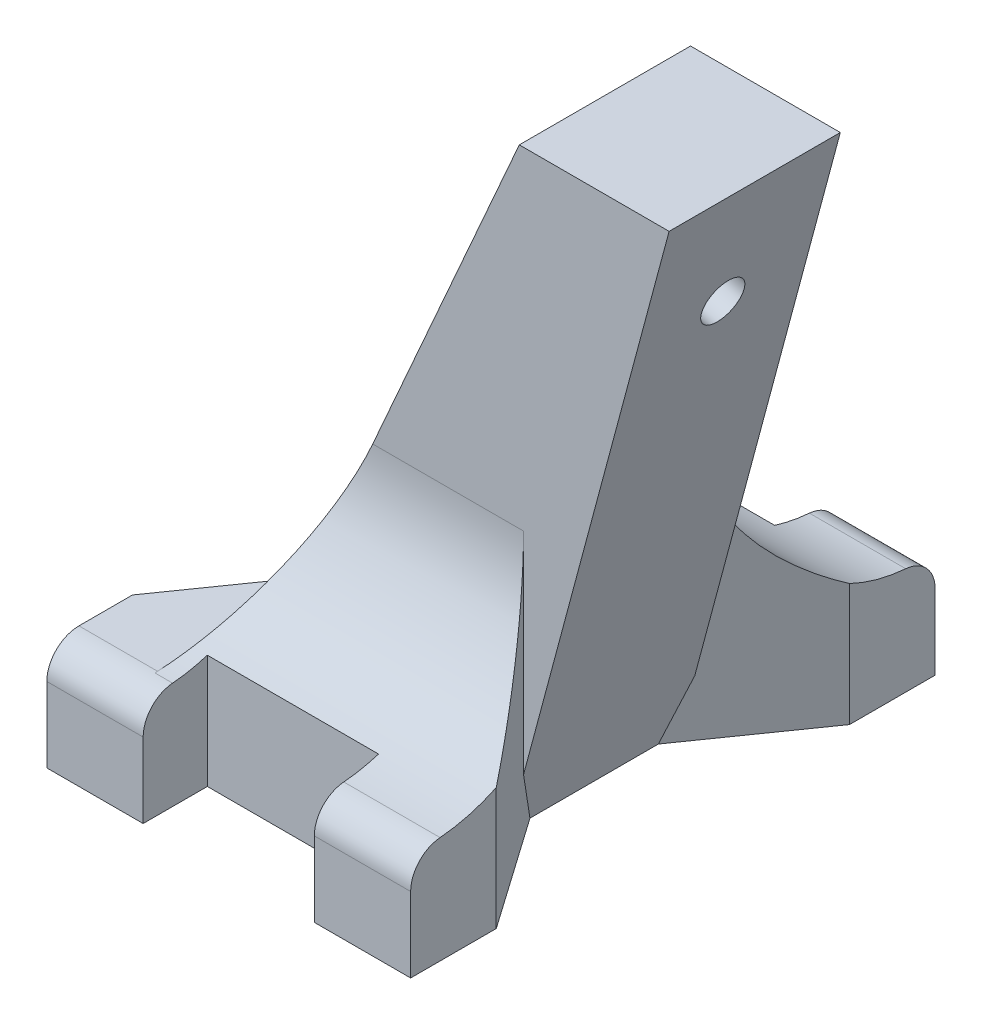
ISO-10303-21;
HEADER;
FILE_DESCRIPTION(('STEP AP214'),'2;1');
FILE_NAME('part.step','',(''),(''),'','','');
FILE_SCHEMA(('AUTOMOTIVE_DESIGN { 1 0 10303 214 1 1 1 1 }'));
ENDSEC;
DATA;
#1=APPLICATION_CONTEXT('core data for automotive mechanical design processes');
#2=APPLICATION_PROTOCOL_DEFINITION('international standard','automotive_design',2000,#1);
#3=PRODUCT_CONTEXT('',#1,'mechanical');
#4=PRODUCT('Part','Part','',(#3));
#5=PRODUCT_RELATED_PRODUCT_CATEGORY('part','',(#4));
#6=PRODUCT_DEFINITION_FORMATION('','',#4);
#7=PRODUCT_DEFINITION_CONTEXT('part definition',#1,'design');
#8=PRODUCT_DEFINITION('design','',#6,#7);
#9=PRODUCT_DEFINITION_SHAPE('','',#8);
#10=(LENGTH_UNIT() NAMED_UNIT(*) SI_UNIT(.MILLI.,.METRE.));
#11=(NAMED_UNIT(*) PLANE_ANGLE_UNIT() SI_UNIT($,.RADIAN.));
#12=(NAMED_UNIT(*) SI_UNIT($,.STERADIAN.) SOLID_ANGLE_UNIT());
#13=UNCERTAINTY_MEASURE_WITH_UNIT(LENGTH_MEASURE(1.E-05),#10,'distance_accuracy_value','');
#14=(GEOMETRIC_REPRESENTATION_CONTEXT(3) GLOBAL_UNCERTAINTY_ASSIGNED_CONTEXT((#13)) GLOBAL_UNIT_ASSIGNED_CONTEXT((#10,
#11,#12)) REPRESENTATION_CONTEXT('',''));
#15=CARTESIAN_POINT('',(0.,0.,0.));
#16=DIRECTION('',(0.,0.,1.));
#17=DIRECTION('',(1.,0.,0.));
#18=AXIS2_PLACEMENT_3D('',#15,#16,#17);
#19=CARTESIAN_POINT('',(-11.7631107649885,5.18773446003204,8.));
#20=DIRECTION('',(0.914971602220709,-0.403518236427635,0.));
#21=DIRECTION('',(0.403518236427635,0.914971602220709,0.));
#22=AXIS2_PLACEMENT_3D('',#19,#20,#21);
#23=PLANE('',#22);
#24=CARTESIAN_POINT('',(7.41347080086838,48.6703480731465,0.));
#25=DIRECTION('',(0.914971602220709,-0.403518236427635,0.));
#26=DIRECTION('',(0.403518236427635,0.914971602220709,0.));
#27=AXIS2_PLACEMENT_3D('',#24,#25,#26);
#28=ELLIPSE('',#27,2.02381441539603,2.);
#29=CARTESIAN_POINT('',(6.59682477711095,46.8186153548942,0.));
#30=VERTEX_POINT('',#29);
#31=CARTESIAN_POINT('',(8.23011682462581,50.5220807913988,0.));
#32=VERTEX_POINT('',#31);
#33=EDGE_CURVE('E249',#30,#32,#28,.T.);
#34=ORIENTED_EDGE('',*,*,#33,.T.);
#35=CARTESIAN_POINT('',(7.41347080086838,48.6703480731465,0.));
#36=DIRECTION('',(-0.914971602220709,0.403518236427635,0.));
#37=DIRECTION('',(-0.403518236427635,-0.914971602220709,0.));
#38=AXIS2_PLACEMENT_3D('',#35,#36,#37);
#39=CIRCLE('',#38,2.02381441539603);
#40=EDGE_CURVE('E54',#32,#30,#39,.T.);
#41=ORIENTED_EDGE('',*,*,#40,.T.);
#42=EDGE_LOOP('',(#34,#41));
#43=FACE_BOUND('',#42,.T.);
#44=ADVANCED_FACE('F40',(#43),#23,.F.);
#45=EDGE_CURVE('E253',#32,#30,#28,.T.);
#46=ORIENTED_EDGE('',*,*,#45,.T.);
#47=EDGE_CURVE('E240',#30,#32,#39,.T.);
#48=ORIENTED_EDGE('',*,*,#47,.T.);
#49=EDGE_LOOP('',(#46,#48));
#50=FACE_BOUND('',#49,.T.);
#51=ADVANCED_FACE('F255',(#50),#23,.F.);
#52=CARTESIAN_POINT('',(0.,10.,0.));
#53=DIRECTION('',(0.,1.,0.));
#54=DIRECTION('',(0.,0.,1.));
#55=AXIS2_PLACEMENT_3D('',#52,#53,#54);
#56=PLANE('',#55);
#57=DIRECTION('',(-1.,0.,0.));
#58=VECTOR('',#57,1.);
#59=CARTESIAN_POINT('',(0.,10.,21.51));
#60=LINE('',#59,#58);
#61=CARTESIAN_POINT('',(-17.,10.,21.51));
#62=VERTEX_POINT('',#61);
#63=CARTESIAN_POINT('',(-9.64081877341594,10.,21.51));
#64=VERTEX_POINT('',#63);
#65=EDGE_CURVE('E342',#62,#64,#60,.F.);
#66=ORIENTED_EDGE('',*,*,#65,.T.);
#67=DIRECTION('',(0.,0.,-1.));
#68=VECTOR('',#67,1.);
#69=CARTESIAN_POINT('',(-9.64081877341594,10.,8.));
#70=LINE('',#69,#68);
#71=CARTESIAN_POINT('',(-9.64081877341594,10.,6.));
#72=VERTEX_POINT('',#71);
#73=EDGE_CURVE('E467',#64,#72,#70,.T.);
#74=ORIENTED_EDGE('',*,*,#73,.T.);
#75=DIRECTION('',(0.573576436351047,0.,-0.819152044288991));
#76=VECTOR('',#75,1.);
#77=CARTESIAN_POINT('',(-3.65000863368049,10.,-2.55576355983361));
#78=LINE('',#77,#76);
#79=CARTESIAN_POINT('',(-17.,10.,16.51));
#80=VERTEX_POINT('',#79);
#81=EDGE_CURVE('E444',#80,#72,#78,.T.);
#82=ORIENTED_EDGE('',*,*,#81,.F.);
#83=DIRECTION('',(0.,0.,-1.));
#84=VECTOR('',#83,1.);
#85=CARTESIAN_POINT('',(-17.,10.,0.));
#86=LINE('',#85,#84);
#87=EDGE_CURVE('E384',#62,#80,#86,.T.);
#88=ORIENTED_EDGE('',*,*,#87,.F.);
#89=EDGE_LOOP('',(#66,#74,#82,#88));
#90=FACE_BOUND('',#89,.T.);
#91=ADVANCED_FACE('F512',(#90),#56,.T.);
#92=CARTESIAN_POINT('',(-9.64081877341594,10.,-6.00000000000002));
#93=VERTEX_POINT('',#92);
#94=CARTESIAN_POINT('',(-9.64081877341594,10.,-21.51));
#95=VERTEX_POINT('',#94);
#96=EDGE_CURVE('E470',#93,#95,#70,.T.);
#97=ORIENTED_EDGE('',*,*,#96,.T.);
#98=DIRECTION('',(-1.,0.,0.));
#99=VECTOR('',#98,1.);
#100=CARTESIAN_POINT('',(-17.,10.,-21.51));
#101=LINE('',#100,#99);
#102=CARTESIAN_POINT('',(-17.,10.,-21.51));
#103=VERTEX_POINT('',#102);
#104=EDGE_CURVE('E340',#95,#103,#101,.T.);
#105=ORIENTED_EDGE('',*,*,#104,.T.);
#106=DIRECTION('',(0.,0.,1.));
#107=VECTOR('',#106,1.);
#108=CARTESIAN_POINT('',(-17.,10.,0.));
#109=LINE('',#108,#107);
#110=CARTESIAN_POINT('',(-17.,10.,-16.51));
#111=VERTEX_POINT('',#110);
#112=EDGE_CURVE('E388',#103,#111,#109,.T.);
#113=ORIENTED_EDGE('',*,*,#112,.T.);
#114=DIRECTION('',(0.573576436351047,0.,0.819152044288991));
#115=VECTOR('',#114,1.);
#116=CARTESIAN_POINT('',(-3.65000863368049,10.,2.55576355983361));
#117=LINE('',#116,#115);
#118=EDGE_CURVE('E449',#111,#93,#117,.T.);
#119=ORIENTED_EDGE('',*,*,#118,.T.);
#120=EDGE_LOOP('',(#97,#105,#113,#119));
#121=FACE_BOUND('',#120,.T.);
#122=ADVANCED_FACE('F561',(#121),#56,.T.);
#123=CARTESIAN_POINT('',(8.,10.,0.));
#124=DIRECTION('',(-1.,0.,0.));
#125=DIRECTION('',(0.,0.,1.));
#126=AXIS2_PLACEMENT_3D('',#123,#124,#125);
#127=PLANE('',#126);
#128=DIRECTION('',(0.,-1.,0.));
#129=VECTOR('',#128,1.);
#130=CARTESIAN_POINT('',(8.,10.,-18.51));
#131=LINE('',#130,#129);
#132=CARTESIAN_POINT('',(8.,10.6259955130901,-18.51));
#133=VERTEX_POINT('',#132);
#134=CARTESIAN_POINT('',(8.,0.,-18.51));
#135=VERTEX_POINT('',#134);
#136=EDGE_CURVE('E345',#133,#135,#131,.T.);
#137=ORIENTED_EDGE('',*,*,#136,.F.);
#138=CARTESIAN_POINT('',(8.,24.9382245498265,-23.));
#139=DIRECTION('',(-1.,0.,0.));
#140=DIRECTION('',(0.,0.,1.));
#141=AXIS2_PLACEMENT_3D('',#138,#139,#140);
#142=CIRCLE('',#141,15.);
#143=CARTESIAN_POINT('',(8.,9.98970435267192,-21.758330190703));
#144=VERTEX_POINT('',#143);
#145=EDGE_CURVE('E282',#133,#144,#142,.F.);
#146=ORIENTED_EDGE('',*,*,#145,.T.);
#147=CARTESIAN_POINT('',(8.,7.,-21.51));
#148=DIRECTION('',(-1.,0.,0.));
#149=DIRECTION('',(0.,0.,1.));
#150=AXIS2_PLACEMENT_3D('',#147,#148,#149);
#151=CIRCLE('',#150,3.);
#152=CARTESIAN_POINT('',(8.,7.,-24.51));
#153=VERTEX_POINT('',#152);
#154=EDGE_CURVE('E325',#144,#153,#151,.T.);
#155=ORIENTED_EDGE('',*,*,#154,.T.);
#156=DIRECTION('',(0.,-1.,0.));
#157=VECTOR('',#156,1.);
#158=CARTESIAN_POINT('',(8.,10.,-24.51));
#159=LINE('',#158,#157);
#160=CARTESIAN_POINT('',(8.,0.,-24.51));
#161=VERTEX_POINT('',#160);
#162=EDGE_CURVE('E382',#153,#161,#159,.T.);
#163=ORIENTED_EDGE('',*,*,#162,.T.);
#164=DIRECTION('',(0.,0.,-1.));
#165=VECTOR('',#164,1.);
#166=CARTESIAN_POINT('',(8.,0.,0.));
#167=LINE('',#166,#165);
#168=EDGE_CURVE('E439',#135,#161,#167,.T.);
#169=ORIENTED_EDGE('',*,*,#168,.F.);
#170=EDGE_LOOP('',(#137,#146,#155,#163,#169));
#171=FACE_BOUND('',#170,.T.);
#172=ADVANCED_FACE('F621',(#171),#127,.T.);
#173=CARTESIAN_POINT('',(0.,10.,-18.51));
#174=DIRECTION('',(0.,0.,1.));
#175=DIRECTION('',(1.,0.,0.));
#176=AXIS2_PLACEMENT_3D('',#173,#174,#175);
#177=PLANE('',#176);
#178=DIRECTION('',(-1.,0.,0.));
#179=VECTOR('',#178,1.);
#180=CARTESIAN_POINT('',(0.,0.,-18.51));
#181=LINE('',#180,#179);
#182=CARTESIAN_POINT('',(-8.,0.,-18.51));
#183=VERTEX_POINT('',#182);
#184=EDGE_CURVE('E437',#135,#183,#181,.T.);
#185=ORIENTED_EDGE('',*,*,#184,.T.);
#186=DIRECTION('',(0.,-1.,0.));
#187=VECTOR('',#186,1.);
#188=CARTESIAN_POINT('',(-8.,10.,-18.51));
#189=LINE('',#188,#187);
#190=CARTESIAN_POINT('',(-8.,10.6259955130902,-18.51));
#191=VERTEX_POINT('',#190);
#192=EDGE_CURVE('E347',#191,#183,#189,.T.);
#193=ORIENTED_EDGE('',*,*,#192,.F.);
#194=DIRECTION('',(1.,0.,0.));
#195=VECTOR('',#194,1.);
#196=CARTESIAN_POINT('',(-8.,10.6259955130902,-18.51));
#197=LINE('',#196,#195);
#198=EDGE_CURVE('E284',#191,#133,#197,.T.);
#199=ORIENTED_EDGE('',*,*,#198,.T.);
#200=ORIENTED_EDGE('',*,*,#136,.T.);
#201=EDGE_LOOP('',(#185,#193,#199,#200));
#202=FACE_BOUND('',#201,.T.);
#203=ADVANCED_FACE('F626',(#202),#177,.F.);
#204=CARTESIAN_POINT('',(-8.,10.,0.));
#205=DIRECTION('',(-1.,0.,0.));
#206=DIRECTION('',(0.,0.,1.));
#207=AXIS2_PLACEMENT_3D('',#204,#205,#206);
#208=PLANE('',#207);
#209=DIRECTION('',(0.,-1.,0.));
#210=VECTOR('',#209,1.);
#211=CARTESIAN_POINT('',(-8.,10.,-24.51));
#212=LINE('',#211,#210);
#213=CARTESIAN_POINT('',(-8.,7.,-24.51));
#214=VERTEX_POINT('',#213);
#215=CARTESIAN_POINT('',(-8.,0.,-24.51));
#216=VERTEX_POINT('',#215);
#217=EDGE_CURVE('E350',#214,#216,#212,.T.);
#218=ORIENTED_EDGE('',*,*,#217,.F.);
#219=CARTESIAN_POINT('',(-8.,7.,-21.51));
#220=DIRECTION('',(-1.,0.,0.));
#221=DIRECTION('',(0.,0.,1.));
#222=AXIS2_PLACEMENT_3D('',#219,#220,#221);
#223=CIRCLE('',#222,3.);
#224=CARTESIAN_POINT('',(-8.,9.98970409163776,-21.7583333333333));
#225=VERTEX_POINT('',#224);
#226=EDGE_CURVE('E333',#214,#225,#223,.F.);
#227=ORIENTED_EDGE('',*,*,#226,.T.);
#228=CARTESIAN_POINT('',(-8.,24.9382245498265,-23.));
#229=DIRECTION('',(-1.,0.,0.));
#230=DIRECTION('',(0.,0.,1.));
#231=AXIS2_PLACEMENT_3D('',#228,#229,#230);
#232=CIRCLE('',#231,15.);
#233=EDGE_CURVE('E287',#225,#191,#232,.T.);
#234=ORIENTED_EDGE('',*,*,#233,.T.);
#235=ORIENTED_EDGE('',*,*,#192,.T.);
#236=DIRECTION('',(0.,0.,-1.));
#237=VECTOR('',#236,1.);
#238=CARTESIAN_POINT('',(-8.,0.,0.));
#239=LINE('',#238,#237);
#240=EDGE_CURVE('E434',#183,#216,#239,.T.);
#241=ORIENTED_EDGE('',*,*,#240,.T.);
#242=EDGE_LOOP('',(#218,#227,#234,#235,#241));
#243=FACE_BOUND('',#242,.T.);
#244=ADVANCED_FACE('F547',(#243),#208,.F.);
#245=CARTESIAN_POINT('',(0.,10.,-24.51));
#246=DIRECTION('',(0.,0.,1.));
#247=DIRECTION('',(1.,0.,0.));
#248=AXIS2_PLACEMENT_3D('',#245,#246,#247);
#249=PLANE('',#248);
#250=DIRECTION('',(0.,-1.,0.));
#251=VECTOR('',#250,1.);
#252=CARTESIAN_POINT('',(-17.,10.,-24.51));
#253=LINE('',#252,#251);
#254=CARTESIAN_POINT('',(-17.,7.,-24.51));
#255=VERTEX_POINT('',#254);
#256=CARTESIAN_POINT('',(-17.,0.,-24.51));
#257=VERTEX_POINT('',#256);
#258=EDGE_CURVE('E352',#255,#257,#253,.T.);
#259=ORIENTED_EDGE('',*,*,#258,.F.);
#260=DIRECTION('',(-1.,0.,0.));
#261=VECTOR('',#260,1.);
#262=CARTESIAN_POINT('',(-8.,7.,-24.51));
#263=LINE('',#262,#261);
#264=EDGE_CURVE('E336',#255,#214,#263,.F.);
#265=ORIENTED_EDGE('',*,*,#264,.T.);
#266=ORIENTED_EDGE('',*,*,#217,.T.);
#267=DIRECTION('',(-1.,0.,0.));
#268=VECTOR('',#267,1.);
#269=CARTESIAN_POINT('',(0.,0.,-24.51));
#270=LINE('',#269,#268);
#271=EDGE_CURVE('E431',#216,#257,#270,.T.);
#272=ORIENTED_EDGE('',*,*,#271,.T.);
#273=EDGE_LOOP('',(#259,#265,#266,#272));
#274=FACE_BOUND('',#273,.T.);
#275=ADVANCED_FACE('F552',(#274),#249,.F.);
#276=CARTESIAN_POINT('',(-17.,10.,0.));
#277=DIRECTION('',(1.,0.,0.));
#278=DIRECTION('',(0.,0.,-1.));
#279=AXIS2_PLACEMENT_3D('',#276,#277,#278);
#280=PLANE('',#279);
#281=ORIENTED_EDGE('',*,*,#112,.F.);
#282=CARTESIAN_POINT('',(-17.,7.,-21.51));
#283=DIRECTION('',(1.,0.,0.));
#284=DIRECTION('',(0.,0.,-1.));
#285=AXIS2_PLACEMENT_3D('',#282,#283,#284);
#286=CIRCLE('',#285,3.);
#287=EDGE_CURVE('E338',#103,#255,#286,.F.);
#288=ORIENTED_EDGE('',*,*,#287,.T.);
#289=ORIENTED_EDGE('',*,*,#258,.T.);
#290=DIRECTION('',(0.,0.,1.));
#291=VECTOR('',#290,1.);
#292=CARTESIAN_POINT('',(-17.,0.,0.));
#293=LINE('',#292,#291);
#294=CARTESIAN_POINT('',(-17.,0.,-16.51));
#295=VERTEX_POINT('',#294);
#296=EDGE_CURVE('E429',#257,#295,#293,.T.);
#297=ORIENTED_EDGE('',*,*,#296,.T.);
#298=DIRECTION('',(0.,-1.,0.));
#299=VECTOR('',#298,1.);
#300=CARTESIAN_POINT('',(-17.,10.,-16.51));
#301=LINE('',#300,#299);
#302=EDGE_CURVE('E354',#111,#295,#301,.T.);
#303=ORIENTED_EDGE('',*,*,#302,.F.);
#304=EDGE_LOOP('',(#281,#288,#289,#297,#303));
#305=FACE_BOUND('',#304,.T.);
#306=ADVANCED_FACE('F558',(#305),#280,.F.);
#307=CARTESIAN_POINT('',(-3.65000863368049,10.,2.55576355983361));
#308=DIRECTION('',(0.819152044288991,0.,-0.573576436351047));
#309=DIRECTION('',(-0.573576436351047,0.,-0.819152044288991));
#310=AXIS2_PLACEMENT_3D('',#307,#308,#309);
#311=PLANE('',#310);
#312=DIRECTION('',(0.573576436351047,0.,0.819152044288991));
#313=VECTOR('',#312,1.);
#314=CARTESIAN_POINT('',(-3.65000863368049,0.,2.55576355983361));
#315=LINE('',#314,#313);
#316=CARTESIAN_POINT('',(-9.64081877341594,0.,-6.));
#317=VERTEX_POINT('',#316);
#318=EDGE_CURVE('E427',#295,#317,#315,.T.);
#319=ORIENTED_EDGE('',*,*,#318,.T.);
#320=DIRECTION('',(0.,-1.,0.));
#321=VECTOR('',#320,1.);
#322=CARTESIAN_POINT('',(-9.64081877341594,10.,-6.));
#323=LINE('',#322,#321);
#324=EDGE_CURVE('E357',#93,#317,#323,.T.);
#325=ORIENTED_EDGE('',*,*,#324,.F.);
#326=ORIENTED_EDGE('',*,*,#118,.F.);
#327=ORIENTED_EDGE('',*,*,#302,.T.);
#328=EDGE_LOOP('',(#319,#325,#326,#327));
#329=FACE_BOUND('',#328,.T.);
#330=ADVANCED_FACE('F867',(#329),#311,.F.);
#331=CARTESIAN_POINT('',(-9.64081877341593,10.,0.));
#332=DIRECTION('',(1.,0.,0.));
#333=DIRECTION('',(0.,0.,-1.));
#334=AXIS2_PLACEMENT_3D('',#331,#332,#333);
#335=PLANE('',#334);
#336=DIRECTION('',(0.,0.,1.));
#337=VECTOR('',#336,1.);
#338=CARTESIAN_POINT('',(-9.64081877341593,0.,0.));
#339=LINE('',#338,#337);
#340=CARTESIAN_POINT('',(-9.64081877341593,0.,6.));
#341=VERTEX_POINT('',#340);
#342=EDGE_CURVE('E424',#317,#341,#339,.T.);
#343=ORIENTED_EDGE('',*,*,#342,.T.);
#344=DIRECTION('',(0.,-1.,0.));
#345=VECTOR('',#344,1.);
#346=CARTESIAN_POINT('',(-9.64081877341593,10.,6.));
#347=LINE('',#346,#345);
#348=EDGE_CURVE('E360',#72,#341,#347,.T.);
#349=ORIENTED_EDGE('',*,*,#348,.F.);
#350=DIRECTION('',(0.,0.,1.));
#351=VECTOR('',#350,1.);
#352=CARTESIAN_POINT('',(-9.64081877341593,10.,0.));
#353=LINE('',#352,#351);
#354=EDGE_CURVE('E447',#93,#72,#353,.T.);
#355=ORIENTED_EDGE('',*,*,#354,.F.);
#356=ORIENTED_EDGE('',*,*,#324,.T.);
#357=EDGE_LOOP('',(#343,#349,#355,#356));
#358=FACE_BOUND('',#357,.T.);
#359=ADVANCED_FACE('F570',(#358),#335,.F.);
#360=CARTESIAN_POINT('',(-3.65000863368049,10.,-2.55576355983361));
#361=DIRECTION('',(-0.819152044288991,0.,-0.573576436351047));
#362=DIRECTION('',(-0.573576436351047,0.,0.819152044288991));
#363=AXIS2_PLACEMENT_3D('',#360,#361,#362);
#364=PLANE('',#363);
#365=DIRECTION('',(0.573576436351047,0.,-0.819152044288991));
#366=VECTOR('',#365,1.);
#367=CARTESIAN_POINT('',(-3.65000863368049,0.,-2.55576355983361));
#368=LINE('',#367,#366);
#369=CARTESIAN_POINT('',(-17.,0.,16.51));
#370=VERTEX_POINT('',#369);
#371=EDGE_CURVE('E421',#370,#341,#368,.T.);
#372=ORIENTED_EDGE('',*,*,#371,.F.);
#373=DIRECTION('',(0.,-1.,0.));
#374=VECTOR('',#373,1.);
#375=CARTESIAN_POINT('',(-17.,10.,16.51));
#376=LINE('',#375,#374);
#377=EDGE_CURVE('E362',#80,#370,#376,.T.);
#378=ORIENTED_EDGE('',*,*,#377,.F.);
#379=ORIENTED_EDGE('',*,*,#81,.T.);
#380=ORIENTED_EDGE('',*,*,#348,.T.);
#381=EDGE_LOOP('',(#372,#378,#379,#380));
#382=FACE_BOUND('',#381,.T.);
#383=ADVANCED_FACE('F575',(#382),#364,.T.);
#384=CARTESIAN_POINT('',(-17.,10.,0.));
#385=DIRECTION('',(-1.,0.,0.));
#386=DIRECTION('',(0.,0.,1.));
#387=AXIS2_PLACEMENT_3D('',#384,#385,#386);
#388=PLANE('',#387);
#389=DIRECTION('',(0.,-1.,0.));
#390=VECTOR('',#389,1.);
#391=CARTESIAN_POINT('',(-17.,10.,24.51));
#392=LINE('',#391,#390);
#393=CARTESIAN_POINT('',(-17.,7.,24.51));
#394=VERTEX_POINT('',#393);
#395=CARTESIAN_POINT('',(-17.,0.,24.51));
#396=VERTEX_POINT('',#395);
#397=EDGE_CURVE('E364',#394,#396,#392,.T.);
#398=ORIENTED_EDGE('',*,*,#397,.F.);
#399=CARTESIAN_POINT('',(-17.,7.,21.51));
#400=DIRECTION('',(-1.,0.,0.));
#401=DIRECTION('',(0.,0.,1.));
#402=AXIS2_PLACEMENT_3D('',#399,#400,#401);
#403=CIRCLE('',#402,3.);
#404=EDGE_CURVE('E313',#394,#62,#403,.T.);
#405=ORIENTED_EDGE('',*,*,#404,.T.);
#406=ORIENTED_EDGE('',*,*,#87,.T.);
#407=ORIENTED_EDGE('',*,*,#377,.T.);
#408=DIRECTION('',(0.,0.,-1.));
#409=VECTOR('',#408,1.);
#410=CARTESIAN_POINT('',(-17.,0.,0.));
#411=LINE('',#410,#409);
#412=EDGE_CURVE('E418',#396,#370,#411,.T.);
#413=ORIENTED_EDGE('',*,*,#412,.F.);
#414=EDGE_LOOP('',(#398,#405,#406,#407,#413));
#415=FACE_BOUND('',#414,.T.);
#416=ADVANCED_FACE('F579',(#415),#388,.T.);
#417=CARTESIAN_POINT('',(0.,10.,24.51));
#418=DIRECTION('',(0.,0.,1.));
#419=DIRECTION('',(1.,0.,0.));
#420=AXIS2_PLACEMENT_3D('',#417,#418,#419);
#421=PLANE('',#420);
#422=DIRECTION('',(0.,-1.,0.));
#423=VECTOR('',#422,1.);
#424=CARTESIAN_POINT('',(-8.,10.,24.51));
#425=LINE('',#424,#423);
#426=CARTESIAN_POINT('',(-8.,7.,24.51));
#427=VERTEX_POINT('',#426);
#428=CARTESIAN_POINT('',(-8.,0.,24.51));
#429=VERTEX_POINT('',#428);
#430=EDGE_CURVE('E366',#427,#429,#425,.T.);
#431=ORIENTED_EDGE('',*,*,#430,.F.);
#432=DIRECTION('',(-1.,0.,0.));
#433=VECTOR('',#432,1.);
#434=CARTESIAN_POINT('',(0.,7.,24.51));
#435=LINE('',#434,#433);
#436=EDGE_CURVE('E315',#427,#394,#435,.T.);
#437=ORIENTED_EDGE('',*,*,#436,.T.);
#438=ORIENTED_EDGE('',*,*,#397,.T.);
#439=DIRECTION('',(-1.,0.,0.));
#440=VECTOR('',#439,1.);
#441=CARTESIAN_POINT('',(0.,0.,24.51));
#442=LINE('',#441,#440);
#443=EDGE_CURVE('E415',#429,#396,#442,.T.);
#444=ORIENTED_EDGE('',*,*,#443,.F.);
#445=EDGE_LOOP('',(#431,#437,#438,#444));
#446=FACE_BOUND('',#445,.T.);
#447=ADVANCED_FACE('F727',(#446),#421,.T.);
#448=CARTESIAN_POINT('',(-8.,10.,0.));
#449=DIRECTION('',(1.,0.,0.));
#450=DIRECTION('',(0.,0.,-1.));
#451=AXIS2_PLACEMENT_3D('',#448,#449,#450);
#452=PLANE('',#451);
#453=DIRECTION('',(0.,-1.,0.));
#454=VECTOR('',#453,1.);
#455=CARTESIAN_POINT('',(-8.,10.,18.51));
#456=LINE('',#455,#454);
#457=CARTESIAN_POINT('',(-8.,10.6259955130902,18.51));
#458=VERTEX_POINT('',#457);
#459=CARTESIAN_POINT('',(-8.,0.,18.51));
#460=VERTEX_POINT('',#459);
#461=EDGE_CURVE('E62',#458,#460,#456,.T.);
#462=ORIENTED_EDGE('',*,*,#461,.F.);
#463=CARTESIAN_POINT('',(-8.,24.9382245498265,23.));
#464=DIRECTION('',(1.,0.,0.));
#465=DIRECTION('',(0.,0.,-1.));
#466=AXIS2_PLACEMENT_3D('',#463,#464,#465);
#467=CIRCLE('',#466,15.);
#468=CARTESIAN_POINT('',(-8.,9.98970409163776,21.7583333333333));
#469=VERTEX_POINT('',#468);
#470=EDGE_CURVE('E262',#458,#469,#467,.F.);
#471=ORIENTED_EDGE('',*,*,#470,.T.);
#472=CARTESIAN_POINT('',(-8.,7.,21.51));
#473=DIRECTION('',(1.,0.,0.));
#474=DIRECTION('',(0.,0.,-1.));
#475=AXIS2_PLACEMENT_3D('',#472,#473,#474);
#476=CIRCLE('',#475,3.);
#477=EDGE_CURVE('E311',#469,#427,#476,.T.);
#478=ORIENTED_EDGE('',*,*,#477,.T.);
#479=ORIENTED_EDGE('',*,*,#430,.T.);
#480=DIRECTION('',(0.,0.,1.));
#481=VECTOR('',#480,1.);
#482=CARTESIAN_POINT('',(-8.,0.,0.));
#483=LINE('',#482,#481);
#484=EDGE_CURVE('E412',#460,#429,#483,.T.);
#485=ORIENTED_EDGE('',*,*,#484,.F.);
#486=EDGE_LOOP('',(#462,#471,#478,#479,#485));
#487=FACE_BOUND('',#486,.T.);
#488=ADVANCED_FACE('F721',(#487),#452,.T.);
#489=CARTESIAN_POINT('',(0.,10.,18.51));
#490=DIRECTION('',(0.,0.,1.));
#491=DIRECTION('',(1.,0.,0.));
#492=AXIS2_PLACEMENT_3D('',#489,#490,#491);
#493=PLANE('',#492);
#494=DIRECTION('',(-1.,0.,0.));
#495=VECTOR('',#494,1.);
#496=CARTESIAN_POINT('',(0.,0.,18.51));
#497=LINE('',#496,#495);
#498=CARTESIAN_POINT('',(8.,0.,18.51));
#499=VERTEX_POINT('',#498);
#500=EDGE_CURVE('E409',#499,#460,#497,.T.);
#501=ORIENTED_EDGE('',*,*,#500,.F.);
#502=DIRECTION('',(0.,-1.,0.));
#503=VECTOR('',#502,1.);
#504=CARTESIAN_POINT('',(8.,10.,18.51));
#505=LINE('',#504,#503);
#506=CARTESIAN_POINT('',(8.,10.6259955130901,18.51));
#507=VERTEX_POINT('',#506);
#508=EDGE_CURVE('E369',#507,#499,#505,.T.);
#509=ORIENTED_EDGE('',*,*,#508,.F.);
#510=DIRECTION('',(-1.,0.,0.));
#511=VECTOR('',#510,1.);
#512=CARTESIAN_POINT('',(8.,10.6259955130901,18.51));
#513=LINE('',#512,#511);
#514=EDGE_CURVE('E264',#507,#458,#513,.T.);
#515=ORIENTED_EDGE('',*,*,#514,.T.);
#516=ORIENTED_EDGE('',*,*,#461,.T.);
#517=EDGE_LOOP('',(#501,#509,#515,#516));
#518=FACE_BOUND('',#517,.T.);
#519=ADVANCED_FACE('F726',(#518),#493,.T.);
#520=CARTESIAN_POINT('',(8.,10.,0.));
#521=DIRECTION('',(1.,0.,0.));
#522=DIRECTION('',(0.,0.,-1.));
#523=AXIS2_PLACEMENT_3D('',#520,#521,#522);
#524=PLANE('',#523);
#525=DIRECTION('',(0.,-1.,0.));
#526=VECTOR('',#525,1.);
#527=CARTESIAN_POINT('',(8.,10.,24.51));
#528=LINE('',#527,#526);
#529=CARTESIAN_POINT('',(8.,7.,24.51));
#530=VERTEX_POINT('',#529);
#531=CARTESIAN_POINT('',(8.,0.,24.51));
#532=VERTEX_POINT('',#531);
#533=EDGE_CURVE('E371',#530,#532,#528,.T.);
#534=ORIENTED_EDGE('',*,*,#533,.F.);
#535=CARTESIAN_POINT('',(8.,7.,21.51));
#536=DIRECTION('',(1.,0.,0.));
#537=DIRECTION('',(0.,0.,-1.));
#538=AXIS2_PLACEMENT_3D('',#535,#536,#537);
#539=CIRCLE('',#538,3.);
#540=CARTESIAN_POINT('',(8.,9.98970435267192,21.758330190703));
#541=VERTEX_POINT('',#540);
#542=EDGE_CURVE('E318',#530,#541,#539,.F.);
#543=ORIENTED_EDGE('',*,*,#542,.T.);
#544=CARTESIAN_POINT('',(8.,24.9382245498265,23.));
#545=DIRECTION('',(1.,0.,0.));
#546=DIRECTION('',(0.,0.,-1.));
#547=AXIS2_PLACEMENT_3D('',#544,#545,#546);
#548=CIRCLE('',#547,15.);
#549=EDGE_CURVE('E266',#541,#507,#548,.T.);
#550=ORIENTED_EDGE('',*,*,#549,.T.);
#551=ORIENTED_EDGE('',*,*,#508,.T.);
#552=DIRECTION('',(0.,0.,1.));
#553=VECTOR('',#552,1.);
#554=CARTESIAN_POINT('',(8.,0.,0.));
#555=LINE('',#554,#553);
#556=EDGE_CURVE('E406',#499,#532,#555,.T.);
#557=ORIENTED_EDGE('',*,*,#556,.T.);
#558=EDGE_LOOP('',(#534,#543,#550,#551,#557));
#559=FACE_BOUND('',#558,.T.);
#560=ADVANCED_FACE('F738',(#559),#524,.F.);
#561=CARTESIAN_POINT('',(0.,10.,24.51));
#562=DIRECTION('',(0.,0.,-1.));
#563=DIRECTION('',(-1.,0.,0.));
#564=AXIS2_PLACEMENT_3D('',#561,#562,#563);
#565=PLANE('',#564);
#566=DIRECTION('',(0.,-1.,0.));
#567=VECTOR('',#566,1.);
#568=CARTESIAN_POINT('',(17.,10.,24.51));
#569=LINE('',#568,#567);
#570=CARTESIAN_POINT('',(17.,7.,24.51));
#571=VERTEX_POINT('',#570);
#572=CARTESIAN_POINT('',(17.,0.,24.51));
#573=VERTEX_POINT('',#572);
#574=EDGE_CURVE('E373',#571,#573,#569,.T.);
#575=ORIENTED_EDGE('',*,*,#574,.F.);
#576=DIRECTION('',(1.,0.,0.));
#577=VECTOR('',#576,1.);
#578=CARTESIAN_POINT('',(8.,7.,24.51));
#579=LINE('',#578,#577);
#580=EDGE_CURVE('E321',#571,#530,#579,.F.);
#581=ORIENTED_EDGE('',*,*,#580,.T.);
#582=ORIENTED_EDGE('',*,*,#533,.T.);
#583=DIRECTION('',(1.,0.,0.));
#584=VECTOR('',#583,1.);
#585=CARTESIAN_POINT('',(0.,0.,24.51));
#586=LINE('',#585,#584);
#587=EDGE_CURVE('E403',#532,#573,#586,.T.);
#588=ORIENTED_EDGE('',*,*,#587,.T.);
#589=EDGE_LOOP('',(#575,#581,#582,#588));
#590=FACE_BOUND('',#589,.T.);
#591=ADVANCED_FACE('F748',(#590),#565,.F.);
#592=CARTESIAN_POINT('',(17.,10.,0.));
#593=DIRECTION('',(-1.,0.,0.));
#594=DIRECTION('',(0.,0.,1.));
#595=AXIS2_PLACEMENT_3D('',#592,#593,#594);
#596=PLANE('',#595);
#597=DIRECTION('',(0.,-1.,0.));
#598=VECTOR('',#597,1.);
#599=CARTESIAN_POINT('',(17.,10.,16.51));
#600=LINE('',#599,#598);
#601=CARTESIAN_POINT('',(17.,11.4149150436443,16.51));
#602=VERTEX_POINT('',#601);
#603=CARTESIAN_POINT('',(17.,0.,16.51));
#604=VERTEX_POINT('',#603);
#605=EDGE_CURVE('E375',#602,#604,#600,.T.);
#606=ORIENTED_EDGE('',*,*,#605,.F.);
#607=CARTESIAN_POINT('',(17.,24.9382245498265,23.));
#608=DIRECTION('',(-1.,0.,0.));
#609=DIRECTION('',(0.,0.,1.));
#610=AXIS2_PLACEMENT_3D('',#607,#608,#609);
#611=CIRCLE('',#610,15.);
#612=CARTESIAN_POINT('',(17.,9.98970435267192,21.758330190703));
#613=VERTEX_POINT('',#612);
#614=EDGE_CURVE('E269',#602,#613,#611,.T.);
#615=ORIENTED_EDGE('',*,*,#614,.T.);
#616=CARTESIAN_POINT('',(17.,7.,21.51));
#617=DIRECTION('',(-1.,0.,0.));
#618=DIRECTION('',(0.,0.,1.));
#619=AXIS2_PLACEMENT_3D('',#616,#617,#618);
#620=CIRCLE('',#619,3.);
#621=EDGE_CURVE('E323',#613,#571,#620,.F.);
#622=ORIENTED_EDGE('',*,*,#621,.T.);
#623=ORIENTED_EDGE('',*,*,#574,.T.);
#624=DIRECTION('',(0.,0.,-1.));
#625=VECTOR('',#624,1.);
#626=CARTESIAN_POINT('',(17.,0.,0.));
#627=LINE('',#626,#625);
#628=EDGE_CURVE('E401',#573,#604,#627,.T.);
#629=ORIENTED_EDGE('',*,*,#628,.T.);
#630=EDGE_LOOP('',(#606,#615,#622,#623,#629));
#631=FACE_BOUND('',#630,.T.);
#632=ADVANCED_FACE('F756',(#631),#596,.F.);
#633=CARTESIAN_POINT('',(3.65000863368049,10.,-2.55576355983361));
#634=DIRECTION('',(-0.819152044288991,0.,0.573576436351047));
#635=DIRECTION('',(0.573576436351047,0.,0.819152044288991));
#636=AXIS2_PLACEMENT_3D('',#633,#634,#635);
#637=PLANE('',#636);
#638=DIRECTION('',(-0.573576436351047,0.,-0.819152044288991));
#639=VECTOR('',#638,1.);
#640=CARTESIAN_POINT('',(3.65000863368049,0.,-2.55576355983361));
#641=LINE('',#640,#639);
#642=CARTESIAN_POINT('',(9.64081877341594,0.,6.));
#643=VERTEX_POINT('',#642);
#644=EDGE_CURVE('E398',#604,#643,#641,.T.);
#645=ORIENTED_EDGE('',*,*,#644,.T.);
#646=DIRECTION('',(0.242765576111726,0.906013464377675,0.346705173629561));
#647=VECTOR('',#646,1.);
#648=CARTESIAN_POINT('',(10.7671162335776,4.20339934575914,7.60851947272862));
#649=LINE('',#648,#647);
#650=CARTESIAN_POINT('',(11.0412338498354,5.22642021688264,8.));
#651=VERTEX_POINT('',#650);
#652=EDGE_CURVE('E442',#643,#651,#649,.T.);
#653=ORIENTED_EDGE('',*,*,#652,.T.);
#654=DIRECTION('',(0.,1.,0.));
#655=VECTOR('',#654,1.);
#656=CARTESIAN_POINT('',(11.0412338498354,10.,8.));
#657=LINE('',#656,#655);
#658=CARTESIAN_POINT('',(11.0412338498354,24.9382245498265,8.));
#659=VERTEX_POINT('',#658);
#660=EDGE_CURVE('E457',#651,#659,#657,.T.);
#661=ORIENTED_EDGE('',*,*,#660,.T.);
#662=CARTESIAN_POINT('',(21.544346922981,24.9382245498265,23.));
#663=DIRECTION('',(-0.819152044288991,0.,0.573576436351047));
#664=DIRECTION('',(-0.573576436351047,0.,-0.819152044288991));
#665=AXIS2_PLACEMENT_3D('',#662,#663,#664);
#666=ELLIPSE('',#665,18.3116188314218,15.);
#667=EDGE_CURVE('E271',#659,#602,#666,.T.);
#668=ORIENTED_EDGE('',*,*,#667,.T.);
#669=ORIENTED_EDGE('',*,*,#605,.T.);
#670=EDGE_LOOP('',(#645,#653,#661,#668,#669));
#671=FACE_BOUND('',#670,.T.);
#672=ADVANCED_FACE('F595',(#671),#637,.F.);
#673=CARTESIAN_POINT('',(3.65000863368049,10.,2.55576355983361));
#674=DIRECTION('',(0.819152044288991,0.,0.573576436351047));
#675=DIRECTION('',(0.573576436351047,0.,-0.819152044288991));
#676=AXIS2_PLACEMENT_3D('',#673,#674,#675);
#677=PLANE('',#676);
#678=DIRECTION('',(0.242765576111726,0.906013464377675,-0.346705173629561));
#679=VECTOR('',#678,1.);
#680=CARTESIAN_POINT('',(10.7671162335776,4.20339934575914,-7.60851947272862));
#681=LINE('',#680,#679);
#682=CARTESIAN_POINT('',(9.64081877341594,0.,-6.));
#683=VERTEX_POINT('',#682);
#684=CARTESIAN_POINT('',(11.0412338498354,5.22642021688264,-8.));
#685=VERTEX_POINT('',#684);
#686=EDGE_CURVE('E455',#683,#685,#681,.T.);
#687=ORIENTED_EDGE('',*,*,#686,.F.);
#688=DIRECTION('',(-0.573576436351047,0.,0.819152044288991));
#689=VECTOR('',#688,1.);
#690=CARTESIAN_POINT('',(3.65000863368049,0.,2.55576355983361));
#691=LINE('',#690,#689);
#692=CARTESIAN_POINT('',(17.,0.,-16.51));
#693=VERTEX_POINT('',#692);
#694=EDGE_CURVE('E392',#693,#683,#691,.T.);
#695=ORIENTED_EDGE('',*,*,#694,.F.);
#696=DIRECTION('',(0.,-1.,0.));
#697=VECTOR('',#696,1.);
#698=CARTESIAN_POINT('',(17.,10.,-16.51));
#699=LINE('',#698,#697);
#700=CARTESIAN_POINT('',(17.,11.4149150436443,-16.51));
#701=VERTEX_POINT('',#700);
#702=EDGE_CURVE('E378',#701,#693,#699,.T.);
#703=ORIENTED_EDGE('',*,*,#702,.F.);
#704=CARTESIAN_POINT('',(21.544346922981,24.9382245498265,-23.));
#705=DIRECTION('',(0.819152044288991,0.,0.573576436351047));
#706=DIRECTION('',(0.573576436351047,0.,-0.819152044288991));
#707=AXIS2_PLACEMENT_3D('',#704,#705,#706);
#708=ELLIPSE('',#707,18.3116188314218,15.);
#709=CARTESIAN_POINT('',(11.0412338498354,24.9382245498265,-8.));
#710=VERTEX_POINT('',#709);
#711=EDGE_CURVE('E276',#701,#710,#708,.F.);
#712=ORIENTED_EDGE('',*,*,#711,.T.);
#713=DIRECTION('',(0.,-1.,0.));
#714=VECTOR('',#713,1.);
#715=CARTESIAN_POINT('',(11.0412338498354,10.,-8.));
#716=LINE('',#715,#714);
#717=EDGE_CURVE('E459',#710,#685,#716,.T.);
#718=ORIENTED_EDGE('',*,*,#717,.T.);
#719=EDGE_LOOP('',(#687,#695,#703,#712,#718));
#720=FACE_BOUND('',#719,.T.);
#721=ADVANCED_FACE('F602',(#720),#677,.T.);
#722=CARTESIAN_POINT('',(17.,10.,0.));
#723=DIRECTION('',(1.,0.,0.));
#724=DIRECTION('',(0.,0.,-1.));
#725=AXIS2_PLACEMENT_3D('',#722,#723,#724);
#726=PLANE('',#725);
#727=DIRECTION('',(0.,-1.,0.));
#728=VECTOR('',#727,1.);
#729=CARTESIAN_POINT('',(17.,10.,-24.51));
#730=LINE('',#729,#728);
#731=CARTESIAN_POINT('',(17.,7.,-24.51));
#732=VERTEX_POINT('',#731);
#733=CARTESIAN_POINT('',(17.,0.,-24.51));
#734=VERTEX_POINT('',#733);
#735=EDGE_CURVE('E380',#732,#734,#730,.T.);
#736=ORIENTED_EDGE('',*,*,#735,.F.);
#737=CARTESIAN_POINT('',(17.,7.,-21.51));
#738=DIRECTION('',(1.,0.,0.));
#739=DIRECTION('',(0.,0.,-1.));
#740=AXIS2_PLACEMENT_3D('',#737,#738,#739);
#741=CIRCLE('',#740,3.);
#742=CARTESIAN_POINT('',(17.,9.98970435267192,-21.758330190703));
#743=VERTEX_POINT('',#742);
#744=EDGE_CURVE('E327',#732,#743,#741,.T.);
#745=ORIENTED_EDGE('',*,*,#744,.T.);
#746=CARTESIAN_POINT('',(17.,24.9382245498265,-23.));
#747=DIRECTION('',(1.,0.,0.));
#748=DIRECTION('',(0.,0.,-1.));
#749=AXIS2_PLACEMENT_3D('',#746,#747,#748);
#750=CIRCLE('',#749,15.);
#751=EDGE_CURVE('E279',#743,#701,#750,.F.);
#752=ORIENTED_EDGE('',*,*,#751,.T.);
#753=ORIENTED_EDGE('',*,*,#702,.T.);
#754=DIRECTION('',(0.,0.,1.));
#755=VECTOR('',#754,1.);
#756=CARTESIAN_POINT('',(17.,0.,0.));
#757=LINE('',#756,#755);
#758=EDGE_CURVE('E389',#734,#693,#757,.T.);
#759=ORIENTED_EDGE('',*,*,#758,.F.);
#760=EDGE_LOOP('',(#736,#745,#752,#753,#759));
#761=FACE_BOUND('',#760,.T.);
#762=ADVANCED_FACE('F609',(#761),#726,.T.);
#763=CARTESIAN_POINT('',(0.,10.,-24.51));
#764=DIRECTION('',(0.,0.,-1.));
#765=DIRECTION('',(-1.,0.,0.));
#766=AXIS2_PLACEMENT_3D('',#763,#764,#765);
#767=PLANE('',#766);
#768=ORIENTED_EDGE('',*,*,#162,.F.);
#769=DIRECTION('',(1.,0.,0.));
#770=VECTOR('',#769,1.);
#771=CARTESIAN_POINT('',(0.,7.,-24.51));
#772=LINE('',#771,#770);
#773=EDGE_CURVE('E330',#153,#732,#772,.T.);
#774=ORIENTED_EDGE('',*,*,#773,.T.);
#775=ORIENTED_EDGE('',*,*,#735,.T.);
#776=DIRECTION('',(1.,0.,0.));
#777=VECTOR('',#776,1.);
#778=CARTESIAN_POINT('',(0.,0.,-24.51));
#779=LINE('',#778,#777);
#780=EDGE_CURVE('E385',#161,#734,#779,.T.);
#781=ORIENTED_EDGE('',*,*,#780,.F.);
#782=EDGE_LOOP('',(#768,#774,#775,#781));
#783=FACE_BOUND('',#782,.T.);
#784=ADVANCED_FACE('F617',(#783),#767,.T.);
#785=CARTESIAN_POINT('',(0.,0.,0.));
#786=DIRECTION('',(0.,1.,0.));
#787=DIRECTION('',(0.,0.,1.));
#788=AXIS2_PLACEMENT_3D('',#785,#786,#787);
#789=PLANE('',#788);
#790=ORIENTED_EDGE('',*,*,#371,.T.);
#791=ORIENTED_EDGE('',*,*,#342,.F.);
#792=ORIENTED_EDGE('',*,*,#318,.F.);
#793=ORIENTED_EDGE('',*,*,#296,.F.);
#794=ORIENTED_EDGE('',*,*,#271,.F.);
#795=ORIENTED_EDGE('',*,*,#240,.F.);
#796=ORIENTED_EDGE('',*,*,#184,.F.);
#797=ORIENTED_EDGE('',*,*,#168,.T.);
#798=ORIENTED_EDGE('',*,*,#780,.T.);
#799=ORIENTED_EDGE('',*,*,#758,.T.);
#800=ORIENTED_EDGE('',*,*,#694,.T.);
#801=DIRECTION('',(0.,0.,1.));
#802=VECTOR('',#801,1.);
#803=CARTESIAN_POINT('',(9.64081877341593,0.,0.));
#804=LINE('',#803,#802);
#805=EDGE_CURVE('E395',#683,#643,#804,.T.);
#806=ORIENTED_EDGE('',*,*,#805,.T.);
#807=ORIENTED_EDGE('',*,*,#644,.F.);
#808=ORIENTED_EDGE('',*,*,#628,.F.);
#809=ORIENTED_EDGE('',*,*,#587,.F.);
#810=ORIENTED_EDGE('',*,*,#556,.F.);
#811=ORIENTED_EDGE('',*,*,#500,.T.);
#812=ORIENTED_EDGE('',*,*,#484,.T.);
#813=ORIENTED_EDGE('',*,*,#443,.T.);
#814=ORIENTED_EDGE('',*,*,#412,.T.);
#815=EDGE_LOOP('',(#790,#791,#792,#793,#794,#795,#796,#797,#798,#799,#800,#806,#807,#808,#809,
#810,#811,#812,#813,#814));
#816=FACE_BOUND('',#815,.T.);
#817=ADVANCED_FACE('F624',(#816),#789,.F.);
#818=CARTESIAN_POINT('',(0.,7.,-21.51));
#819=DIRECTION('',(1.,0.,0.));
#820=DIRECTION('',(0.,0.,-1.));
#821=AXIS2_PLACEMENT_3D('',#818,#819,#820);
#822=CYLINDRICAL_SURFACE('',#821,3.);
#823=CARTESIAN_POINT('',(-10.9638704466534,7.,-21.51));
#824=DIRECTION('',(0.914971602220709,-0.403518236427635,0.));
#825=DIRECTION('',(0.403518236427635,0.914971602220709,0.));
#826=AXIS2_PLACEMENT_3D('',#823,#824,#825);
#827=ELLIPSE('',#826,3.27879028454955,3.);
#828=CARTESIAN_POINT('',(-9.64535944634466,9.98970409163776,-21.7583333333333));
#829=VERTEX_POINT('',#828);
#830=EDGE_CURVE('E308',#95,#829,#827,.F.);
#831=ORIENTED_EDGE('',*,*,#830,.T.);
#832=DIRECTION('',(1.,0.,0.));
#833=VECTOR('',#832,1.);
#834=CARTESIAN_POINT('',(0.,9.98970409163776,-21.7583333333333));
#835=LINE('',#834,#833);
#836=EDGE_CURVE('E305',#829,#225,#835,.T.);
#837=ORIENTED_EDGE('',*,*,#836,.T.);
#838=ORIENTED_EDGE('',*,*,#226,.F.);
#839=ORIENTED_EDGE('',*,*,#264,.F.);
#840=ORIENTED_EDGE('',*,*,#287,.F.);
#841=ORIENTED_EDGE('',*,*,#104,.F.);
#842=EDGE_LOOP('',(#831,#837,#838,#839,#840,#841));
#843=FACE_BOUND('',#842,.T.);
#844=ADVANCED_FACE('F542',(#843),#822,.T.);
#845=CARTESIAN_POINT('',(0.,7.,-21.51));
#846=DIRECTION('',(1.,0.,0.));
#847=DIRECTION('',(0.,0.,-1.));
#848=AXIS2_PLACEMENT_3D('',#845,#846,#847);
#849=CYLINDRICAL_SURFACE('',#848,3.);
#850=ORIENTED_EDGE('',*,*,#154,.F.);
#851=DIRECTION('',(1.,0.,0.));
#852=VECTOR('',#851,1.);
#853=CARTESIAN_POINT('',(12.5,9.98970409163776,-21.7583333333333));
#854=LINE('',#853,#852);
#855=EDGE_CURVE('E301',#144,#743,#854,.T.);
#856=ORIENTED_EDGE('',*,*,#855,.T.);
#857=ORIENTED_EDGE('',*,*,#744,.F.);
#858=ORIENTED_EDGE('',*,*,#773,.F.);
#859=EDGE_LOOP('',(#850,#856,#857,#858));
#860=FACE_BOUND('',#859,.T.);
#861=ADVANCED_FACE('F614',(#860),#849,.T.);
#862=CARTESIAN_POINT('',(0.,7.,21.51));
#863=DIRECTION('',(-1.,0.,0.));
#864=DIRECTION('',(0.,0.,1.));
#865=AXIS2_PLACEMENT_3D('',#862,#863,#864);
#866=CYLINDRICAL_SURFACE('',#865,3.);
#867=ORIENTED_EDGE('',*,*,#621,.F.);
#868=DIRECTION('',(-1.,0.,0.));
#869=VECTOR('',#868,1.);
#870=CARTESIAN_POINT('',(12.5,9.98970409163776,21.7583333333333));
#871=LINE('',#870,#869);
#872=EDGE_CURVE('E296',#613,#541,#871,.T.);
#873=ORIENTED_EDGE('',*,*,#872,.T.);
#874=ORIENTED_EDGE('',*,*,#542,.F.);
#875=ORIENTED_EDGE('',*,*,#580,.F.);
#876=EDGE_LOOP('',(#867,#873,#874,#875));
#877=FACE_BOUND('',#876,.T.);
#878=ADVANCED_FACE('F641',(#877),#866,.T.);
#879=CARTESIAN_POINT('',(0.,7.,21.51));
#880=DIRECTION('',(-1.,0.,0.));
#881=DIRECTION('',(0.,0.,1.));
#882=AXIS2_PLACEMENT_3D('',#879,#880,#881);
#883=CYLINDRICAL_SURFACE('',#882,3.);
#884=ORIENTED_EDGE('',*,*,#477,.F.);
#885=DIRECTION('',(-1.,0.,0.));
#886=VECTOR('',#885,1.);
#887=CARTESIAN_POINT('',(0.,9.98970409163776,21.7583333333333));
#888=LINE('',#887,#886);
#889=CARTESIAN_POINT('',(-9.64535944634466,9.98970409163776,21.7583333333333));
#890=VERTEX_POINT('',#889);
#891=EDGE_CURVE('E290',#469,#890,#888,.T.);
#892=ORIENTED_EDGE('',*,*,#891,.T.);
#893=CARTESIAN_POINT('',(-10.9638704466534,7.,21.51));
#894=DIRECTION('',(0.914971602220709,-0.403518236427635,0.));
#895=DIRECTION('',(-0.403518236427635,-0.914971602220709,0.));
#896=AXIS2_PLACEMENT_3D('',#893,#894,#895);
#897=ELLIPSE('',#896,3.27879028454955,3.);
#898=EDGE_CURVE('E293',#890,#64,#897,.F.);
#899=ORIENTED_EDGE('',*,*,#898,.T.);
#900=ORIENTED_EDGE('',*,*,#65,.F.);
#901=ORIENTED_EDGE('',*,*,#404,.F.);
#902=ORIENTED_EDGE('',*,*,#436,.F.);
#903=EDGE_LOOP('',(#884,#892,#899,#900,#901,#902));
#904=FACE_BOUND('',#903,.T.);
#905=ADVANCED_FACE('F582',(#904),#883,.T.);
#906=CARTESIAN_POINT('',(8.99500637223801,-2.41020469335402,8.));
#907=DIRECTION('',(0.965925826289067,-0.258819045102525,0.));
#908=DIRECTION('',(0.258819045102525,0.965925826289067,0.));
#909=AXIS2_PLACEMENT_3D('',#906,#907,#908);
#910=PLANE('',#909);
#911=CARTESIAN_POINT('',(21.6592017690759,44.8532159646242,0.));
#912=DIRECTION('',(0.965925826289067,-0.258819045102525,0.));
#913=DIRECTION('',(0.258819045102525,0.965925826289067,0.));
#914=AXIS2_PLACEMENT_3D('',#911,#912,#913);
#915=CIRCLE('',#914,2.);
#916=CARTESIAN_POINT('',(22.176839859281,46.7850676172023,0.));
#917=VERTEX_POINT('',#916);
#918=EDGE_CURVE('E254',#917,#917,#915,.T.);
#919=ORIENTED_EDGE('',*,*,#918,.F.);
#920=EDGE_LOOP('',(#919));
#921=FACE_BOUND('',#920,.T.);
#922=ORIENTED_EDGE('',*,*,#652,.F.);
#923=ORIENTED_EDGE('',*,*,#805,.F.);
#924=ORIENTED_EDGE('',*,*,#686,.T.);
#925=DIRECTION('',(-0.258819045102525,-0.965925826289067,0.));
#926=VECTOR('',#925,1.);
#927=CARTESIAN_POINT('',(8.99500637223801,-2.41020469335402,-8.));
#928=LINE('',#927,#926);
#929=CARTESIAN_POINT('',(24.645973549559,56.,-8.));
#930=VERTEX_POINT('',#929);
#931=EDGE_CURVE('E256',#930,#685,#928,.T.);
#932=ORIENTED_EDGE('',*,*,#931,.F.);
#933=DIRECTION('',(0.,0.,-1.));
#934=VECTOR('',#933,1.);
#935=CARTESIAN_POINT('',(24.645973549559,56.,8.));
#936=LINE('',#935,#934);
#937=CARTESIAN_POINT('',(24.645973549559,56.,8.));
#938=VERTEX_POINT('',#937);
#939=EDGE_CURVE('E462',#938,#930,#936,.T.);
#940=ORIENTED_EDGE('',*,*,#939,.F.);
#941=DIRECTION('',(-0.258819045102525,-0.965925826289067,0.));
#942=VECTOR('',#941,1.);
#943=CARTESIAN_POINT('',(8.99500637223801,-2.41020469335402,8.));
#944=LINE('',#943,#942);
#945=EDGE_CURVE('E474',#938,#651,#944,.T.);
#946=ORIENTED_EDGE('',*,*,#945,.T.);
#947=EDGE_LOOP('',(#922,#923,#924,#932,#940,#946));
#948=FACE_BOUND('',#947,.T.);
#949=ADVANCED_FACE('F598',(#921,#948),#910,.T.);
#950=CARTESIAN_POINT('',(0.,0.,8.));
#951=DIRECTION('',(0.,0.,1.));
#952=DIRECTION('',(1.,0.,0.));
#953=AXIS2_PLACEMENT_3D('',#950,#951,#952);
#954=PLANE('',#953);
#955=DIRECTION('',(-0.403518236427635,-0.914971602220709,0.));
#956=VECTOR('',#955,1.);
#957=CARTESIAN_POINT('',(-11.7631107649885,5.18773446003204,8.));
#958=LINE('',#957,#956);
#959=CARTESIAN_POINT('',(10.645973549559,56.,8.));
#960=VERTEX_POINT('',#959);
#961=CARTESIAN_POINT('',(-3.05280444480077,24.9382245498265,8.));
#962=VERTEX_POINT('',#961);
#963=EDGE_CURVE('E476',#960,#962,#958,.T.);
#964=ORIENTED_EDGE('',*,*,#963,.T.);
#965=DIRECTION('',(1.,0.,0.));
#966=VECTOR('',#965,1.);
#967=CARTESIAN_POINT('',(11.0412338498354,24.9382245498265,8.));
#968=LINE('',#967,#966);
#969=EDGE_CURVE('E298',#962,#659,#968,.T.);
#970=ORIENTED_EDGE('',*,*,#969,.T.);
#971=ORIENTED_EDGE('',*,*,#660,.F.);
#972=ORIENTED_EDGE('',*,*,#945,.F.);
#973=DIRECTION('',(-1.,0.,0.));
#974=VECTOR('',#973,1.);
#975=CARTESIAN_POINT('',(0.,56.,8.));
#976=LINE('',#975,#974);
#977=EDGE_CURVE('E479',#938,#960,#976,.T.);
#978=ORIENTED_EDGE('',*,*,#977,.T.);
#979=EDGE_LOOP('',(#964,#970,#971,#972,#978));
#980=FACE_BOUND('',#979,.T.);
#981=ADVANCED_FACE('F525',(#980),#954,.T.);
#982=CARTESIAN_POINT('',(0.,56.,8.));
#983=DIRECTION('',(0.,-1.,0.));
#984=DIRECTION('',(0.,0.,-1.));
#985=AXIS2_PLACEMENT_3D('',#982,#983,#984);
#986=PLANE('',#985);
#987=DIRECTION('',(-1.,0.,0.));
#988=VECTOR('',#987,1.);
#989=CARTESIAN_POINT('',(0.,56.,-8.));
#990=LINE('',#989,#988);
#991=CARTESIAN_POINT('',(10.645973549559,56.,-8.));
#992=VERTEX_POINT('',#991);
#993=EDGE_CURVE('E258',#930,#992,#990,.T.);
#994=ORIENTED_EDGE('',*,*,#993,.T.);
#995=DIRECTION('',(0.,0.,-1.));
#996=VECTOR('',#995,1.);
#997=CARTESIAN_POINT('',(10.645973549559,56.,8.));
#998=LINE('',#997,#996);
#999=EDGE_CURVE('E464',#960,#992,#998,.T.);
#1000=ORIENTED_EDGE('',*,*,#999,.F.);
#1001=ORIENTED_EDGE('',*,*,#977,.F.);
#1002=ORIENTED_EDGE('',*,*,#939,.T.);
#1003=EDGE_LOOP('',(#994,#1000,#1001,#1002));
#1004=FACE_BOUND('',#1003,.T.);
#1005=ADVANCED_FACE('F517',(#1004),#986,.F.);
#1006=CARTESIAN_POINT('',(7.41347080086838,48.6703480731465,0.));
#1007=DIRECTION('',(0.914971602220709,-0.403518236427635,0.));
#1008=DIRECTION('',(0.403518236427635,0.914971602220709,0.));
#1009=AXIS2_PLACEMENT_3D('',#1006,#1007,#1008);
#1010=CIRCLE('',#1009,3.5);
#1011=CARTESIAN_POINT('',(8.8257846283651,51.872748680919,0.));
#1012=VERTEX_POINT('',#1011);
#1013=EDGE_CURVE('E11',#1012,#1012,#1010,.F.);
#1014=ORIENTED_EDGE('',*,*,#1013,.F.);
#1015=EDGE_LOOP('',(#1014));
#1016=FACE_BOUND('',#1015,.T.);
#1017=DIRECTION('',(-0.403518236427635,-0.914971602220709,0.));
#1018=VECTOR('',#1017,1.);
#1019=CARTESIAN_POINT('',(-11.7631107649885,5.18773446003204,-8.));
#1020=LINE('',#1019,#1018);
#1021=CARTESIAN_POINT('',(-3.05280444480077,24.9382245498265,-8.));
#1022=VERTEX_POINT('',#1021);
#1023=EDGE_CURVE('E471',#992,#1022,#1020,.T.);
#1024=ORIENTED_EDGE('',*,*,#1023,.T.);
#1025=CARTESIAN_POINT('',(-3.05280444480077,24.9382245498265,-23.));
#1026=DIRECTION('',(0.914971602220709,-0.403518236427635,0.));
#1027=DIRECTION('',(0.403518236427635,0.914971602220709,0.));
#1028=AXIS2_PLACEMENT_3D('',#1025,#1026,#1027);
#1029=ELLIPSE('',#1028,16.3939514227478,15.);
#1030=EDGE_CURVE('E274',#1022,#829,#1029,.T.);
#1031=ORIENTED_EDGE('',*,*,#1030,.T.);
#1032=ORIENTED_EDGE('',*,*,#830,.F.);
#1033=ORIENTED_EDGE('',*,*,#96,.F.);
#1034=ORIENTED_EDGE('',*,*,#354,.T.);
#1035=ORIENTED_EDGE('',*,*,#73,.F.);
#1036=ORIENTED_EDGE('',*,*,#898,.F.);
#1037=CARTESIAN_POINT('',(-3.05280444480077,24.9382245498265,23.));
#1038=DIRECTION('',(0.914971602220709,-0.403518236427635,0.));
#1039=DIRECTION('',(-0.403518236427635,-0.914971602220709,0.));
#1040=AXIS2_PLACEMENT_3D('',#1037,#1038,#1039);
#1041=ELLIPSE('',#1040,16.3939514227478,15.);
#1042=EDGE_CURVE('E48',#890,#962,#1041,.T.);
#1043=ORIENTED_EDGE('',*,*,#1042,.T.);
#1044=ORIENTED_EDGE('',*,*,#963,.F.);
#1045=ORIENTED_EDGE('',*,*,#999,.T.);
#1046=EDGE_LOOP('',(#1024,#1031,#1032,#1033,#1034,#1035,#1036,#1043,#1044,#1045));
#1047=FACE_BOUND('',#1046,.T.);
#1048=ADVANCED_FACE('F508',(#1016,#1047),#23,.F.);
#1049=CARTESIAN_POINT('',(0.,0.,-8.));
#1050=DIRECTION('',(0.,0.,1.));
#1051=DIRECTION('',(1.,0.,0.));
#1052=AXIS2_PLACEMENT_3D('',#1049,#1050,#1051);
#1053=PLANE('',#1052);
#1054=ORIENTED_EDGE('',*,*,#717,.F.);
#1055=DIRECTION('',(1.,0.,0.));
#1056=VECTOR('',#1055,1.);
#1057=CARTESIAN_POINT('',(0.,24.9382245498265,-8.));
#1058=LINE('',#1057,#1056);
#1059=EDGE_CURVE('E303',#710,#1022,#1058,.F.);
#1060=ORIENTED_EDGE('',*,*,#1059,.T.);
#1061=ORIENTED_EDGE('',*,*,#1023,.F.);
#1062=ORIENTED_EDGE('',*,*,#993,.F.);
#1063=ORIENTED_EDGE('',*,*,#931,.T.);
#1064=EDGE_LOOP('',(#1054,#1060,#1061,#1062,#1063));
#1065=FACE_BOUND('',#1064,.T.);
#1066=ADVANCED_FACE('F516',(#1065),#1053,.F.);
#1067=CARTESIAN_POINT('',(0.,24.9382245498265,-23.));
#1068=DIRECTION('',(1.,0.,0.));
#1069=DIRECTION('',(0.,0.,-1.));
#1070=AXIS2_PLACEMENT_3D('',#1067,#1068,#1069);
#1071=CYLINDRICAL_SURFACE('',#1070,15.);
#1072=ORIENTED_EDGE('',*,*,#1030,.F.);
#1073=ORIENTED_EDGE('',*,*,#1059,.F.);
#1074=ORIENTED_EDGE('',*,*,#711,.F.);
#1075=ORIENTED_EDGE('',*,*,#751,.F.);
#1076=ORIENTED_EDGE('',*,*,#855,.F.);
#1077=ORIENTED_EDGE('',*,*,#145,.F.);
#1078=ORIENTED_EDGE('',*,*,#198,.F.);
#1079=ORIENTED_EDGE('',*,*,#233,.F.);
#1080=ORIENTED_EDGE('',*,*,#836,.F.);
#1081=EDGE_LOOP('',(#1072,#1073,#1074,#1075,#1076,#1077,#1078,#1079,#1080));
#1082=FACE_BOUND('',#1081,.T.);
#1083=ADVANCED_FACE('F523',(#1082),#1071,.F.);
#1084=CARTESIAN_POINT('',(0.,24.9382245498265,23.));
#1085=DIRECTION('',(-1.,0.,0.));
#1086=DIRECTION('',(0.,0.,1.));
#1087=AXIS2_PLACEMENT_3D('',#1084,#1085,#1086);
#1088=CYLINDRICAL_SURFACE('',#1087,15.);
#1089=ORIENTED_EDGE('',*,*,#1042,.F.);
#1090=ORIENTED_EDGE('',*,*,#891,.F.);
#1091=ORIENTED_EDGE('',*,*,#470,.F.);
#1092=ORIENTED_EDGE('',*,*,#514,.F.);
#1093=ORIENTED_EDGE('',*,*,#549,.F.);
#1094=ORIENTED_EDGE('',*,*,#872,.F.);
#1095=ORIENTED_EDGE('',*,*,#614,.F.);
#1096=ORIENTED_EDGE('',*,*,#667,.F.);
#1097=ORIENTED_EDGE('',*,*,#969,.F.);
#1098=EDGE_LOOP('',(#1089,#1090,#1091,#1092,#1093,#1094,#1095,#1096,#1097));
#1099=FACE_BOUND('',#1098,.T.);
#1100=ADVANCED_FACE('F42',(#1099),#1088,.F.);
#1101=CARTESIAN_POINT('',(-17.19702053533,55.2647093520141,0.));
#1102=DIRECTION('',(0.965925826289067,-0.258819045102525,0.));
#1103=DIRECTION('',(0.258819045102525,0.965925826289067,0.));
#1104=AXIS2_PLACEMENT_3D('',#1101,#1102,#1103);
#1105=CYLINDRICAL_SURFACE('',#1104,2.);
#1106=ORIENTED_EDGE('',*,*,#918,.T.);
#1107=EDGE_LOOP('',(#1106));
#1108=FACE_BOUND('',#1107,.T.);
#1109=ORIENTED_EDGE('',*,*,#45,.F.);
#1110=ORIENTED_EDGE('',*,*,#33,.F.);
#1111=EDGE_LOOP('',(#1109,#1110));
#1112=FACE_BOUND('',#1111,.T.);
#1113=ADVANCED_FACE('F252',(#1108,#1112),#1105,.F.);
#1114=CARTESIAN_POINT('',(6.49849919864767,49.0738663095741,0.));
#1115=DIRECTION('',(-0.914971602220709,0.403518236427635,0.));
#1116=DIRECTION('',(-0.403518236427635,-0.914971602220709,0.));
#1117=AXIS2_PLACEMENT_3D('',#1114,#1115,#1116);
#1118=PLANE('',#1117);
#1119=CARTESIAN_POINT('',(6.49849919864767,49.0738663095741,0.));
#1120=DIRECTION('',(-0.914971602220709,0.403518236427635,0.));
#1121=DIRECTION('',(-0.403518236427635,-0.914971602220709,0.));
#1122=AXIS2_PLACEMENT_3D('',#1119,#1120,#1121);
#1123=CIRCLE('',#1122,3.5);
#1124=CARTESIAN_POINT('',(5.08618537115095,45.8714657018016,0.));
#1125=VERTEX_POINT('',#1124);
#1126=EDGE_CURVE('E485',#1125,#1125,#1123,.T.);
#1127=ORIENTED_EDGE('',*,*,#1126,.T.);
#1128=EDGE_LOOP('',(#1127));
#1129=FACE_BOUND('',#1128,.T.);
#1130=CARTESIAN_POINT('',(6.49849919864767,49.0738663095741,0.));
#1131=DIRECTION('',(-0.914971602220709,0.403518236427635,0.));
#1132=DIRECTION('',(-0.403518236427635,-0.914971602220709,0.));
#1133=AXIS2_PLACEMENT_3D('',#1130,#1131,#1132);
#1134=CIRCLE('',#1133,2.02381441539603);
#1135=CARTESIAN_POINT('',(5.68185317489024,47.2221335913218,0.));
#1136=VERTEX_POINT('',#1135);
#1137=EDGE_CURVE('E245',#1136,#1136,#1134,.T.);
#1138=ORIENTED_EDGE('',*,*,#1137,.F.);
#1139=EDGE_LOOP('',(#1138));
#1140=FACE_BOUND('',#1139,.T.);
#1141=ADVANCED_FACE('F492',(#1129,#1140),#1118,.T.);
#1142=CARTESIAN_POINT('',(6.49849919864767,49.0738663095741,0.));
#1143=DIRECTION('',(0.914971602220709,-0.403518236427635,0.));
#1144=DIRECTION('',(0.403518236427635,0.914971602220709,0.));
#1145=AXIS2_PLACEMENT_3D('',#1142,#1143,#1144);
#1146=CYLINDRICAL_SURFACE('',#1145,3.5);
#1147=ORIENTED_EDGE('',*,*,#1126,.F.);
#1148=EDGE_LOOP('',(#1147));
#1149=FACE_BOUND('',#1148,.T.);
#1150=ORIENTED_EDGE('',*,*,#1013,.T.);
#1151=EDGE_LOOP('',(#1150));
#1152=FACE_BOUND('',#1151,.T.);
#1153=ADVANCED_FACE('F494',(#1149,#1152),#1146,.T.);
#1154=CARTESIAN_POINT('',(6.49849919864767,49.0738663095741,0.));
#1155=DIRECTION('',(0.914971602220709,-0.403518236427635,0.));
#1156=DIRECTION('',(0.403518236427635,0.914971602220709,0.));
#1157=AXIS2_PLACEMENT_3D('',#1154,#1155,#1156);
#1158=CYLINDRICAL_SURFACE('',#1157,2.02381441539603);
#1159=ORIENTED_EDGE('',*,*,#1137,.T.);
#1160=EDGE_LOOP('',(#1159));
#1161=FACE_BOUND('',#1160,.T.);
#1162=ORIENTED_EDGE('',*,*,#47,.F.);
#1163=ORIENTED_EDGE('',*,*,#40,.F.);
#1164=EDGE_LOOP('',(#1162,#1163));
#1165=FACE_BOUND('',#1164,.T.);
#1166=ADVANCED_FACE('F241',(#1161,#1165),#1158,.F.);
#1167=CLOSED_SHELL('',(#44,#51,#91,#122,#172,#203,#244,#275,#306,#330,#359,#383,#416,#447,#488,
#519,#560,#591,#632,#672,#721,#762,#784,#817,#844,#861,#878,#905,#949,#981,#1005,#1048,#1066,
#1083,#1100,#1113,#1141,#1153,#1166));
#1168=MANIFOLD_SOLID_BREP('B2',#1167);
#1169=ADVANCED_BREP_SHAPE_REPRESENTATION('',(#18,#1168),#14);
#1170=SHAPE_DEFINITION_REPRESENTATION(#9,#1169);
ENDSEC;
END-ISO-10303-21;
